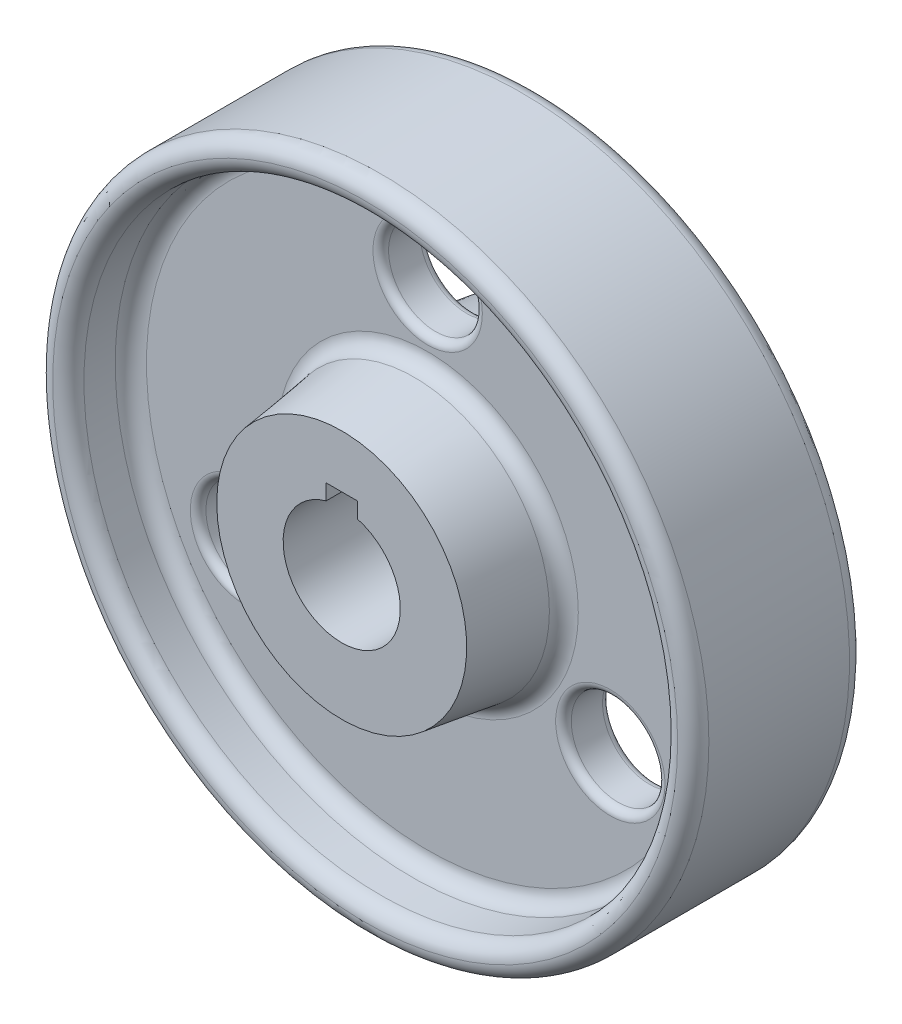
ISO-10303-21;
HEADER;
FILE_DESCRIPTION(('STEP AP214'),'2;1');
FILE_NAME('part.step','',(''),(''),'','','');
FILE_SCHEMA(('AUTOMOTIVE_DESIGN { 1 0 10303 214 1 1 1 1 }'));
ENDSEC;
DATA;
#1=APPLICATION_CONTEXT('core data for automotive mechanical design processes');
#2=APPLICATION_PROTOCOL_DEFINITION('international standard','automotive_design',2000,#1);
#3=PRODUCT_CONTEXT('',#1,'mechanical');
#4=PRODUCT('Part','Part','',(#3));
#5=PRODUCT_RELATED_PRODUCT_CATEGORY('part','',(#4));
#6=PRODUCT_DEFINITION_FORMATION('','',#4);
#7=PRODUCT_DEFINITION_CONTEXT('part definition',#1,'design');
#8=PRODUCT_DEFINITION('design','',#6,#7);
#9=PRODUCT_DEFINITION_SHAPE('','',#8);
#10=(LENGTH_UNIT() NAMED_UNIT(*) SI_UNIT(.MILLI.,.METRE.));
#11=(NAMED_UNIT(*) PLANE_ANGLE_UNIT() SI_UNIT($,.RADIAN.));
#12=(NAMED_UNIT(*) SI_UNIT($,.STERADIAN.) SOLID_ANGLE_UNIT());
#13=UNCERTAINTY_MEASURE_WITH_UNIT(LENGTH_MEASURE(1.E-05),#10,'distance_accuracy_value','');
#14=(GEOMETRIC_REPRESENTATION_CONTEXT(3) GLOBAL_UNCERTAINTY_ASSIGNED_CONTEXT((#13)) GLOBAL_UNIT_ASSIGNED_CONTEXT((#10,
#11,#12)) REPRESENTATION_CONTEXT('',''));
#15=CARTESIAN_POINT('',(0.,0.,0.));
#16=DIRECTION('',(0.,0.,1.));
#17=DIRECTION('',(1.,0.,0.));
#18=AXIS2_PLACEMENT_3D('',#15,#16,#17);
#19=CARTESIAN_POINT('',(0.,11.90625,22.225));
#20=DIRECTION('',(0.,0.,1.));
#21=DIRECTION('',(1.,0.,0.));
#22=AXIS2_PLACEMENT_3D('',#19,#20,#21);
#23=PLANE('',#22);
#24=DIRECTION('',(0.,-1.,0.));
#25=VECTOR('',#24,1.);
#26=CARTESIAN_POINT('',(-3.175,14.6501106339983,22.225));
#27=LINE('',#26,#25);
#28=CARTESIAN_POINT('',(-3.175,14.6501106339983,22.225));
#29=VERTEX_POINT('',#28);
#30=CARTESIAN_POINT('',(-3.175,11.4751106339983,22.225));
#31=VERTEX_POINT('',#30);
#32=EDGE_CURVE('E93',#29,#31,#27,.T.);
#33=ORIENTED_EDGE('',*,*,#32,.F.);
#34=DIRECTION('',(-1.,0.,0.));
#35=VECTOR('',#34,1.);
#36=CARTESIAN_POINT('',(-3.175,14.6501106339983,22.225));
#37=LINE('',#36,#35);
#38=CARTESIAN_POINT('',(3.175,14.6501106339983,22.225));
#39=VERTEX_POINT('',#38);
#40=EDGE_CURVE('E106',#39,#29,#37,.T.);
#41=ORIENTED_EDGE('',*,*,#40,.F.);
#42=DIRECTION('',(0.,1.,0.));
#43=VECTOR('',#42,1.);
#44=CARTESIAN_POINT('',(3.175,14.6501106339983,22.225));
#45=LINE('',#44,#43);
#46=CARTESIAN_POINT('',(3.175,11.4751106339983,22.225));
#47=VERTEX_POINT('',#46);
#48=EDGE_CURVE('E526',#47,#39,#45,.T.);
#49=ORIENTED_EDGE('',*,*,#48,.F.);
#50=CARTESIAN_POINT('',(0.,0.,22.225));
#51=DIRECTION('',(0.,0.,-1.));
#52=DIRECTION('',(-1.,0.,0.));
#53=AXIS2_PLACEMENT_3D('',#50,#51,#52);
#54=CIRCLE('',#53,11.90625);
#55=EDGE_CURVE('E110',#47,#31,#54,.T.);
#56=ORIENTED_EDGE('',*,*,#55,.T.);
#57=EDGE_LOOP('',(#33,#41,#49,#56));
#58=FACE_BOUND('',#57,.T.);
#59=CARTESIAN_POINT('',(0.,0.,22.225));
#60=DIRECTION('',(0.,0.,-1.));
#61=DIRECTION('',(-1.,0.,0.));
#62=AXIS2_PLACEMENT_3D('',#59,#60,#61);
#63=CIRCLE('',#62,25.4);
#64=CARTESIAN_POINT('',(-25.4,0.,22.225));
#65=VERTEX_POINT('',#64);
#66=EDGE_CURVE('E113',#65,#65,#63,.T.);
#67=ORIENTED_EDGE('',*,*,#66,.F.);
#68=EDGE_LOOP('',(#67));
#69=FACE_BOUND('',#68,.T.);
#70=ADVANCED_FACE('F46',(#58,#69),#23,.T.);
#71=CARTESIAN_POINT('',(0.,0.,4.7625));
#72=DIRECTION('',(0.,0.,-1.));
#73=DIRECTION('',(-1.,0.,0.));
#74=AXIS2_PLACEMENT_3D('',#71,#72,#73);
#75=CONICAL_SURFACE('',#74,27.8541943259905,0.139626340159547);
#76=CARTESIAN_POINT('',(0.,0.,7.49562540445179));
#77=DIRECTION('',(0.,0.,-1.));
#78=DIRECTION('',(-1.,0.,0.));
#79=AXIS2_PLACEMENT_3D('',#76,#77,#78);
#80=CIRCLE('',#79,27.4700786003025);
#81=CARTESIAN_POINT('',(-27.4700786003025,0.,7.49562540445179));
#82=VERTEX_POINT('',#81);
#83=EDGE_CURVE('E161',#82,#82,#80,.F.);
#84=ORIENTED_EDGE('',*,*,#83,.T.);
#85=EDGE_LOOP('',(#84));
#86=FACE_BOUND('',#85,.T.);
#87=ORIENTED_EDGE('',*,*,#66,.T.);
#88=EDGE_LOOP('',(#87));
#89=FACE_BOUND('',#88,.T.);
#90=ADVANCED_FACE('F207',(#86,#89),#75,.T.);
#91=CARTESIAN_POINT('',(0.,27.8541943259905,4.7625));
#92=DIRECTION('',(0.,0.,1.));
#93=DIRECTION('',(1.,0.,0.));
#94=AXIS2_PLACEMENT_3D('',#91,#92,#93);
#95=PLANE('',#94);
#96=CARTESIAN_POINT('',(0.,0.,4.7625));
#97=DIRECTION('',(0.,0.,1.));
#98=DIRECTION('',(1.,0.,0.));
#99=AXIS2_PLACEMENT_3D('',#96,#97,#98);
#100=CIRCLE('',#99,30.614179718557);
#101=CARTESIAN_POINT('',(30.614179718557,0.,4.7625));
#102=VERTEX_POINT('',#101);
#103=EDGE_CURVE('E158',#102,#102,#100,.F.);
#104=ORIENTED_EDGE('',*,*,#103,.T.);
#105=EDGE_LOOP('',(#104));
#106=FACE_BOUND('',#105,.T.);
#107=CARTESIAN_POINT('',(0.,0.,4.7625));
#108=DIRECTION('',(0.,0.,1.));
#109=DIRECTION('',(1.,0.,0.));
#110=AXIS2_PLACEMENT_3D('',#107,#108,#109);
#111=CIRCLE('',#110,57.15);
#112=CARTESIAN_POINT('',(57.15,0.,4.7625));
#113=VERTEX_POINT('',#112);
#114=EDGE_CURVE('E155',#113,#113,#111,.T.);
#115=ORIENTED_EDGE('',*,*,#114,.T.);
#116=EDGE_LOOP('',(#115));
#117=FACE_BOUND('',#116,.T.);
#118=CARTESIAN_POINT('',(37.1200138697107,-21.4312499999997,4.7625));
#119=DIRECTION('',(0.,0.,1.));
#120=DIRECTION('',(1.,0.,0.));
#121=AXIS2_PLACEMENT_3D('',#118,#119,#120);
#122=CIRCLE('',#121,11.1125);
#123=CARTESIAN_POINT('',(48.2325138697107,-21.4312499999997,4.7625));
#124=VERTEX_POINT('',#123);
#125=EDGE_CURVE('E131',#124,#124,#122,.F.);
#126=ORIENTED_EDGE('',*,*,#125,.T.);
#127=EDGE_LOOP('',(#126));
#128=FACE_BOUND('',#127,.T.);
#129=CARTESIAN_POINT('',(0.,42.8625,4.7625));
#130=DIRECTION('',(0.,0.,1.));
#131=DIRECTION('',(1.,0.,0.));
#132=AXIS2_PLACEMENT_3D('',#129,#130,#131);
#133=CIRCLE('',#132,11.1125);
#134=CARTESIAN_POINT('',(11.1125,42.8625,4.7625));
#135=VERTEX_POINT('',#134);
#136=EDGE_CURVE('E128',#135,#135,#133,.F.);
#137=ORIENTED_EDGE('',*,*,#136,.T.);
#138=EDGE_LOOP('',(#137));
#139=FACE_BOUND('',#138,.T.);
#140=CARTESIAN_POINT('',(-37.1200138697104,-21.4312500000002,4.7625));
#141=DIRECTION('',(0.,0.,1.));
#142=DIRECTION('',(1.,0.,0.));
#143=AXIS2_PLACEMENT_3D('',#140,#141,#142);
#144=CIRCLE('',#143,11.1125);
#145=CARTESIAN_POINT('',(-26.0075138697104,-21.4312500000002,4.7625));
#146=VERTEX_POINT('',#145);
#147=EDGE_CURVE('E125',#146,#146,#144,.F.);
#148=ORIENTED_EDGE('',*,*,#147,.T.);
#149=EDGE_LOOP('',(#148));
#150=FACE_BOUND('',#149,.T.);
#151=ADVANCED_FACE('F213',(#106,#117,#128,#139,#150),#95,.T.);
#152=CARTESIAN_POINT('',(0.,0.,60.));
#153=DIRECTION('',(0.,0.,-1.));
#154=DIRECTION('',(-1.,0.,0.));
#155=AXIS2_PLACEMENT_3D('',#152,#153,#154);
#156=CYLINDRICAL_SURFACE('',#155,60.325);
#157=CARTESIAN_POINT('',(0.,0.,7.9375));
#158=DIRECTION('',(0.,0.,1.));
#159=DIRECTION('',(1.,0.,0.));
#160=AXIS2_PLACEMENT_3D('',#157,#158,#159);
#161=CIRCLE('',#160,60.325);
#162=CARTESIAN_POINT('',(60.325,0.,7.9375));
#163=VERTEX_POINT('',#162);
#164=EDGE_CURVE('E167',#163,#163,#161,.F.);
#165=ORIENTED_EDGE('',*,*,#164,.T.);
#166=EDGE_LOOP('',(#165));
#167=FACE_BOUND('',#166,.T.);
#168=CARTESIAN_POINT('',(0.,0.,14.2875));
#169=DIRECTION('',(0.,0.,1.));
#170=DIRECTION('',(1.,0.,0.));
#171=AXIS2_PLACEMENT_3D('',#168,#169,#170);
#172=CIRCLE('',#171,60.325);
#173=CARTESIAN_POINT('',(60.325,0.,14.2875));
#174=VERTEX_POINT('',#173);
#175=EDGE_CURVE('E164',#174,#174,#172,.T.);
#176=ORIENTED_EDGE('',*,*,#175,.T.);
#177=EDGE_LOOP('',(#176));
#178=FACE_BOUND('',#177,.T.);
#179=ADVANCED_FACE('F313',(#167,#178),#156,.F.);
#180=CARTESIAN_POINT('',(0.,0.,60.));
#181=DIRECTION('',(0.,0.,-1.));
#182=DIRECTION('',(-1.,0.,0.));
#183=AXIS2_PLACEMENT_3D('',#180,#181,#182);
#184=CYLINDRICAL_SURFACE('',#183,66.675);
#185=CARTESIAN_POINT('',(0.,0.,-14.2875));
#186=DIRECTION('',(0.,0.,-1.));
#187=DIRECTION('',(-1.,0.,0.));
#188=AXIS2_PLACEMENT_3D('',#185,#186,#187);
#189=CIRCLE('',#188,66.675);
#190=CARTESIAN_POINT('',(-66.675,0.,-14.2875));
#191=VERTEX_POINT('',#190);
#192=EDGE_CURVE('E13',#191,#191,#189,.F.);
#193=ORIENTED_EDGE('',*,*,#192,.T.);
#194=EDGE_LOOP('',(#193));
#195=FACE_BOUND('',#194,.T.);
#196=CARTESIAN_POINT('',(0.,0.,14.2875));
#197=DIRECTION('',(0.,0.,1.));
#198=DIRECTION('',(1.,0.,0.));
#199=AXIS2_PLACEMENT_3D('',#196,#197,#198);
#200=CIRCLE('',#199,66.675);
#201=CARTESIAN_POINT('',(66.675,0.,14.2875));
#202=VERTEX_POINT('',#201);
#203=EDGE_CURVE('E54',#202,#202,#200,.F.);
#204=ORIENTED_EDGE('',*,*,#203,.T.);
#205=EDGE_LOOP('',(#204));
#206=FACE_BOUND('',#205,.T.);
#207=ADVANCED_FACE('F193',(#195,#206),#184,.T.);
#208=CARTESIAN_POINT('',(0.,0.,60.));
#209=DIRECTION('',(0.,0.,-1.));
#210=DIRECTION('',(-1.,0.,0.));
#211=AXIS2_PLACEMENT_3D('',#208,#209,#210);
#212=CYLINDRICAL_SURFACE('',#211,60.325);
#213=CARTESIAN_POINT('',(0.,0.,-14.2875));
#214=DIRECTION('',(0.,0.,-1.));
#215=DIRECTION('',(-1.,0.,0.));
#216=AXIS2_PLACEMENT_3D('',#213,#214,#215);
#217=CIRCLE('',#216,60.325);
#218=CARTESIAN_POINT('',(-60.325,0.,-14.2875));
#219=VERTEX_POINT('',#218);
#220=EDGE_CURVE('E185',#219,#219,#217,.T.);
#221=ORIENTED_EDGE('',*,*,#220,.T.);
#222=EDGE_LOOP('',(#221));
#223=FACE_BOUND('',#222,.T.);
#224=CARTESIAN_POINT('',(0.,0.,-7.9375));
#225=DIRECTION('',(0.,0.,-1.));
#226=DIRECTION('',(-1.,0.,0.));
#227=AXIS2_PLACEMENT_3D('',#224,#225,#226);
#228=CIRCLE('',#227,60.325);
#229=CARTESIAN_POINT('',(-60.325,0.,-7.9375));
#230=VERTEX_POINT('',#229);
#231=EDGE_CURVE('E182',#230,#230,#228,.F.);
#232=ORIENTED_EDGE('',*,*,#231,.T.);
#233=EDGE_LOOP('',(#232));
#234=FACE_BOUND('',#233,.T.);
#235=ADVANCED_FACE('F276',(#223,#234),#212,.F.);
#236=CARTESIAN_POINT('',(0.,60.325,-4.7625));
#237=DIRECTION('',(0.,0.,-1.));
#238=DIRECTION('',(-1.,0.,0.));
#239=AXIS2_PLACEMENT_3D('',#236,#237,#238);
#240=PLANE('',#239);
#241=CARTESIAN_POINT('',(0.,0.,-4.7625));
#242=DIRECTION('',(0.,0.,-1.));
#243=DIRECTION('',(-1.,0.,0.));
#244=AXIS2_PLACEMENT_3D('',#241,#242,#243);
#245=CIRCLE('',#244,30.614179718557);
#246=CARTESIAN_POINT('',(-30.614179718557,0.,-4.7625));
#247=VERTEX_POINT('',#246);
#248=EDGE_CURVE('E179',#247,#247,#245,.F.);
#249=ORIENTED_EDGE('',*,*,#248,.T.);
#250=EDGE_LOOP('',(#249));
#251=FACE_BOUND('',#250,.T.);
#252=CARTESIAN_POINT('',(0.,0.,-4.7625));
#253=DIRECTION('',(0.,0.,-1.));
#254=DIRECTION('',(-1.,0.,0.));
#255=AXIS2_PLACEMENT_3D('',#252,#253,#254);
#256=CIRCLE('',#255,57.15);
#257=CARTESIAN_POINT('',(-57.15,0.,-4.7625));
#258=VERTEX_POINT('',#257);
#259=EDGE_CURVE('E176',#258,#258,#256,.T.);
#260=ORIENTED_EDGE('',*,*,#259,.T.);
#261=EDGE_LOOP('',(#260));
#262=FACE_BOUND('',#261,.T.);
#263=CARTESIAN_POINT('',(0.,42.8625,-4.7625));
#264=DIRECTION('',(0.,0.,-1.));
#265=DIRECTION('',(-1.,0.,0.));
#266=AXIS2_PLACEMENT_3D('',#263,#264,#265);
#267=CIRCLE('',#266,11.1125);
#268=CARTESIAN_POINT('',(-11.1125,42.8625,-4.7625));
#269=VERTEX_POINT('',#268);
#270=EDGE_CURVE('E152',#269,#269,#267,.F.);
#271=ORIENTED_EDGE('',*,*,#270,.T.);
#272=EDGE_LOOP('',(#271));
#273=FACE_BOUND('',#272,.T.);
#274=CARTESIAN_POINT('',(37.1200138697107,-21.4312499999997,-4.7625));
#275=DIRECTION('',(0.,0.,-1.));
#276=DIRECTION('',(-1.,0.,0.));
#277=AXIS2_PLACEMENT_3D('',#274,#275,#276);
#278=CIRCLE('',#277,11.1125);
#279=CARTESIAN_POINT('',(26.0075138697107,-21.4312499999997,-4.7625));
#280=VERTEX_POINT('',#279);
#281=EDGE_CURVE('E149',#280,#280,#278,.F.);
#282=ORIENTED_EDGE('',*,*,#281,.T.);
#283=EDGE_LOOP('',(#282));
#284=FACE_BOUND('',#283,.T.);
#285=CARTESIAN_POINT('',(-37.1200138697104,-21.4312500000002,-4.7625));
#286=DIRECTION('',(0.,0.,-1.));
#287=DIRECTION('',(-1.,0.,0.));
#288=AXIS2_PLACEMENT_3D('',#285,#286,#287);
#289=CIRCLE('',#288,11.1125);
#290=CARTESIAN_POINT('',(-48.2325138697104,-21.4312500000002,-4.7625));
#291=VERTEX_POINT('',#290);
#292=EDGE_CURVE('E146',#291,#291,#289,.F.);
#293=ORIENTED_EDGE('',*,*,#292,.T.);
#294=EDGE_LOOP('',(#293));
#295=FACE_BOUND('',#294,.T.);
#296=ADVANCED_FACE('F272',(#251,#262,#273,#284,#295),#240,.T.);
#297=CARTESIAN_POINT('',(0.,0.,-22.225));
#298=DIRECTION('',(0.,0.,1.));
#299=DIRECTION('',(1.,0.,0.));
#300=AXIS2_PLACEMENT_3D('',#297,#298,#299);
#301=CONICAL_SURFACE('',#300,25.4,0.139626340159547);
#302=CARTESIAN_POINT('',(0.,0.,-7.49562540445179));
#303=DIRECTION('',(0.,0.,1.));
#304=DIRECTION('',(1.,0.,0.));
#305=AXIS2_PLACEMENT_3D('',#302,#303,#304);
#306=CIRCLE('',#305,27.4700786003025);
#307=CARTESIAN_POINT('',(27.4700786003025,0.,-7.49562540445179));
#308=VERTEX_POINT('',#307);
#309=EDGE_CURVE('E173',#308,#308,#306,.F.);
#310=ORIENTED_EDGE('',*,*,#309,.T.);
#311=EDGE_LOOP('',(#310));
#312=FACE_BOUND('',#311,.T.);
#313=CARTESIAN_POINT('',(0.,0.,-22.225));
#314=DIRECTION('',(0.,0.,-1.));
#315=DIRECTION('',(-1.,0.,0.));
#316=AXIS2_PLACEMENT_3D('',#313,#314,#315);
#317=CIRCLE('',#316,25.4);
#318=CARTESIAN_POINT('',(-25.4,0.,-22.225));
#319=VERTEX_POINT('',#318);
#320=EDGE_CURVE('E109',#319,#319,#317,.T.);
#321=ORIENTED_EDGE('',*,*,#320,.F.);
#322=EDGE_LOOP('',(#321));
#323=FACE_BOUND('',#322,.T.);
#324=ADVANCED_FACE('F275',(#312,#323),#301,.T.);
#325=CARTESIAN_POINT('',(0.,11.90625,-22.225));
#326=DIRECTION('',(0.,0.,-1.));
#327=DIRECTION('',(-1.,0.,0.));
#328=AXIS2_PLACEMENT_3D('',#325,#326,#327);
#329=PLANE('',#328);
#330=DIRECTION('',(0.,-1.,0.));
#331=VECTOR('',#330,1.);
#332=CARTESIAN_POINT('',(-3.175,14.6501106339983,-22.225));
#333=LINE('',#332,#331);
#334=CARTESIAN_POINT('',(-3.175,14.6501106339983,-22.225));
#335=VERTEX_POINT('',#334);
#336=CARTESIAN_POINT('',(-3.175,11.4751106339983,-22.225));
#337=VERTEX_POINT('',#336);
#338=EDGE_CURVE('E90',#335,#337,#333,.T.);
#339=ORIENTED_EDGE('',*,*,#338,.T.);
#340=CARTESIAN_POINT('',(0.,0.,-22.225));
#341=DIRECTION('',(0.,0.,-1.));
#342=DIRECTION('',(-1.,0.,0.));
#343=AXIS2_PLACEMENT_3D('',#340,#341,#342);
#344=CIRCLE('',#343,11.90625);
#345=CARTESIAN_POINT('',(3.175,11.4751106339983,-22.225));
#346=VERTEX_POINT('',#345);
#347=EDGE_CURVE('E105',#346,#337,#344,.T.);
#348=ORIENTED_EDGE('',*,*,#347,.F.);
#349=DIRECTION('',(0.,1.,0.));
#350=VECTOR('',#349,1.);
#351=CARTESIAN_POINT('',(3.175,14.6501106339983,-22.225));
#352=LINE('',#351,#350);
#353=CARTESIAN_POINT('',(3.175,14.6501106339983,-22.225));
#354=VERTEX_POINT('',#353);
#355=EDGE_CURVE('E61',#346,#354,#352,.T.);
#356=ORIENTED_EDGE('',*,*,#355,.T.);
#357=DIRECTION('',(-1.,0.,0.));
#358=VECTOR('',#357,1.);
#359=CARTESIAN_POINT('',(-3.175,14.6501106339983,-22.225));
#360=LINE('',#359,#358);
#361=EDGE_CURVE('E99',#354,#335,#360,.T.);
#362=ORIENTED_EDGE('',*,*,#361,.T.);
#363=EDGE_LOOP('',(#339,#348,#356,#362));
#364=FACE_BOUND('',#363,.T.);
#365=ORIENTED_EDGE('',*,*,#320,.T.);
#366=EDGE_LOOP('',(#365));
#367=FACE_BOUND('',#366,.T.);
#368=ADVANCED_FACE('F103',(#364,#367),#329,.T.);
#369=CARTESIAN_POINT('',(0.,0.,60.));
#370=DIRECTION('',(0.,0.,-1.));
#371=DIRECTION('',(-1.,0.,0.));
#372=AXIS2_PLACEMENT_3D('',#369,#370,#371);
#373=CYLINDRICAL_SURFACE('',#372,11.90625);
#374=DIRECTION('',(0.,0.,1.));
#375=VECTOR('',#374,1.);
#376=CARTESIAN_POINT('',(-3.175,11.4751106339983,-22.225));
#377=LINE('',#376,#375);
#378=EDGE_CURVE('E87',#337,#31,#377,.T.);
#379=ORIENTED_EDGE('',*,*,#378,.T.);
#380=ORIENTED_EDGE('',*,*,#55,.F.);
#381=DIRECTION('',(0.,0.,1.));
#382=VECTOR('',#381,1.);
#383=CARTESIAN_POINT('',(3.175,11.4751106339983,-22.225));
#384=LINE('',#383,#382);
#385=EDGE_CURVE('E98',#346,#47,#384,.T.);
#386=ORIENTED_EDGE('',*,*,#385,.F.);
#387=ORIENTED_EDGE('',*,*,#347,.T.);
#388=EDGE_LOOP('',(#379,#380,#386,#387));
#389=FACE_BOUND('',#388,.T.);
#390=ADVANCED_FACE('F108',(#389),#373,.F.);
#391=CARTESIAN_POINT('',(0.,42.8625,4.7625));
#392=DIRECTION('',(0.,0.,1.));
#393=DIRECTION('',(1.,0.,0.));
#394=AXIS2_PLACEMENT_3D('',#391,#392,#393);
#395=CYLINDRICAL_SURFACE('',#394,9.52499999999999);
#396=CARTESIAN_POINT('',(0.,42.8625,3.175));
#397=DIRECTION('',(0.,0.,1.));
#398=DIRECTION('',(1.,0.,0.));
#399=AXIS2_PLACEMENT_3D('',#396,#397,#398);
#400=CIRCLE('',#399,9.52499999999999);
#401=CARTESIAN_POINT('',(9.52499999999999,42.8625,3.175));
#402=VERTEX_POINT('',#401);
#403=EDGE_CURVE('E137',#402,#402,#400,.T.);
#404=ORIENTED_EDGE('',*,*,#403,.T.);
#405=EDGE_LOOP('',(#404));
#406=FACE_BOUND('',#405,.T.);
#407=CARTESIAN_POINT('',(0.,42.8625,-3.175));
#408=DIRECTION('',(0.,0.,-1.));
#409=DIRECTION('',(-1.,0.,0.));
#410=AXIS2_PLACEMENT_3D('',#407,#408,#409);
#411=CIRCLE('',#410,9.52499999999999);
#412=CARTESIAN_POINT('',(-9.52499999999999,42.8625,-3.175));
#413=VERTEX_POINT('',#412);
#414=EDGE_CURVE('E134',#413,#413,#411,.T.);
#415=ORIENTED_EDGE('',*,*,#414,.T.);
#416=EDGE_LOOP('',(#415));
#417=FACE_BOUND('',#416,.T.);
#418=ADVANCED_FACE('F289',(#406,#417),#395,.F.);
#419=CARTESIAN_POINT('',(-37.1200138697104,-21.4312500000002,4.7625));
#420=DIRECTION('',(0.,0.,1.));
#421=DIRECTION('',(1.,0.,0.));
#422=AXIS2_PLACEMENT_3D('',#419,#420,#421);
#423=CYLINDRICAL_SURFACE('',#422,9.52499999999999);
#424=CARTESIAN_POINT('',(-37.1200138697104,-21.4312500000002,3.175));
#425=DIRECTION('',(0.,0.,1.));
#426=DIRECTION('',(1.,0.,0.));
#427=AXIS2_PLACEMENT_3D('',#424,#425,#426);
#428=CIRCLE('',#427,9.52499999999999);
#429=CARTESIAN_POINT('',(-27.5950138697104,-21.4312500000002,3.175));
#430=VERTEX_POINT('',#429);
#431=EDGE_CURVE('E143',#430,#430,#428,.T.);
#432=ORIENTED_EDGE('',*,*,#431,.T.);
#433=EDGE_LOOP('',(#432));
#434=FACE_BOUND('',#433,.T.);
#435=CARTESIAN_POINT('',(-37.1200138697104,-21.4312500000002,-3.175));
#436=DIRECTION('',(0.,0.,-1.));
#437=DIRECTION('',(-1.,0.,0.));
#438=AXIS2_PLACEMENT_3D('',#435,#436,#437);
#439=CIRCLE('',#438,9.52499999999999);
#440=CARTESIAN_POINT('',(-46.6450138697104,-21.4312500000002,-3.175));
#441=VERTEX_POINT('',#440);
#442=EDGE_CURVE('E140',#441,#441,#439,.T.);
#443=ORIENTED_EDGE('',*,*,#442,.T.);
#444=EDGE_LOOP('',(#443));
#445=FACE_BOUND('',#444,.T.);
#446=ADVANCED_FACE('F287',(#434,#445),#423,.F.);
#447=CARTESIAN_POINT('',(37.1200138697107,-21.4312499999997,4.7625));
#448=DIRECTION('',(0.,0.,1.));
#449=DIRECTION('',(1.,0.,0.));
#450=AXIS2_PLACEMENT_3D('',#447,#448,#449);
#451=CYLINDRICAL_SURFACE('',#450,9.52499999999999);
#452=CARTESIAN_POINT('',(37.1200138697107,-21.4312499999997,3.175));
#453=DIRECTION('',(0.,0.,1.));
#454=DIRECTION('',(1.,0.,0.));
#455=AXIS2_PLACEMENT_3D('',#452,#453,#454);
#456=CIRCLE('',#455,9.52499999999999);
#457=CARTESIAN_POINT('',(46.6450138697107,-21.4312499999997,3.175));
#458=VERTEX_POINT('',#457);
#459=EDGE_CURVE('E122',#458,#458,#456,.T.);
#460=ORIENTED_EDGE('',*,*,#459,.T.);
#461=EDGE_LOOP('',(#460));
#462=FACE_BOUND('',#461,.T.);
#463=CARTESIAN_POINT('',(37.1200138697107,-21.4312499999997,-3.175));
#464=DIRECTION('',(0.,0.,-1.));
#465=DIRECTION('',(-1.,0.,0.));
#466=AXIS2_PLACEMENT_3D('',#463,#464,#465);
#467=CIRCLE('',#466,9.52499999999999);
#468=CARTESIAN_POINT('',(27.5950138697107,-21.4312499999997,-3.175));
#469=VERTEX_POINT('',#468);
#470=EDGE_CURVE('E119',#469,#469,#467,.T.);
#471=ORIENTED_EDGE('',*,*,#470,.T.);
#472=EDGE_LOOP('',(#471));
#473=FACE_BOUND('',#472,.T.);
#474=ADVANCED_FACE('F223',(#462,#473),#451,.F.);
#475=CARTESIAN_POINT('',(37.1200138697107,-21.4312499999997,3.175));
#476=DIRECTION('',(0.,0.,1.));
#477=DIRECTION('',(1.,0.,0.));
#478=AXIS2_PLACEMENT_3D('',#475,#476,#477);
#479=TOROIDAL_SURFACE('',#478,11.1125,1.5875);
#480=ORIENTED_EDGE('',*,*,#125,.F.);
#481=EDGE_LOOP('',(#480));
#482=FACE_BOUND('',#481,.T.);
#483=ORIENTED_EDGE('',*,*,#459,.F.);
#484=EDGE_LOOP('',(#483));
#485=FACE_BOUND('',#484,.T.);
#486=ADVANCED_FACE('F219',(#482,#485),#479,.T.);
#487=CARTESIAN_POINT('',(0.,42.8625,3.175));
#488=DIRECTION('',(0.,0.,1.));
#489=DIRECTION('',(1.,0.,0.));
#490=AXIS2_PLACEMENT_3D('',#487,#488,#489);
#491=TOROIDAL_SURFACE('',#490,11.1125,1.5875);
#492=ORIENTED_EDGE('',*,*,#136,.F.);
#493=EDGE_LOOP('',(#492));
#494=FACE_BOUND('',#493,.T.);
#495=ORIENTED_EDGE('',*,*,#403,.F.);
#496=EDGE_LOOP('',(#495));
#497=FACE_BOUND('',#496,.T.);
#498=ADVANCED_FACE('F222',(#494,#497),#491,.T.);
#499=CARTESIAN_POINT('',(-37.1200138697104,-21.4312500000002,3.175));
#500=DIRECTION('',(0.,0.,1.));
#501=DIRECTION('',(1.,0.,0.));
#502=AXIS2_PLACEMENT_3D('',#499,#500,#501);
#503=TOROIDAL_SURFACE('',#502,11.1125,1.5875);
#504=ORIENTED_EDGE('',*,*,#147,.F.);
#505=EDGE_LOOP('',(#504));
#506=FACE_BOUND('',#505,.T.);
#507=ORIENTED_EDGE('',*,*,#431,.F.);
#508=EDGE_LOOP('',(#507));
#509=FACE_BOUND('',#508,.T.);
#510=ADVANCED_FACE('F227',(#506,#509),#503,.T.);
#511=CARTESIAN_POINT('',(0.,42.8625,-3.175));
#512=DIRECTION('',(0.,0.,-1.));
#513=DIRECTION('',(-1.,0.,0.));
#514=AXIS2_PLACEMENT_3D('',#511,#512,#513);
#515=TOROIDAL_SURFACE('',#514,11.1125,1.5875);
#516=ORIENTED_EDGE('',*,*,#270,.F.);
#517=EDGE_LOOP('',(#516));
#518=FACE_BOUND('',#517,.T.);
#519=ORIENTED_EDGE('',*,*,#414,.F.);
#520=EDGE_LOOP('',(#519));
#521=FACE_BOUND('',#520,.T.);
#522=ADVANCED_FACE('F231',(#518,#521),#515,.T.);
#523=CARTESIAN_POINT('',(37.1200138697107,-21.4312499999997,-3.175));
#524=DIRECTION('',(0.,0.,-1.));
#525=DIRECTION('',(-1.,0.,0.));
#526=AXIS2_PLACEMENT_3D('',#523,#524,#525);
#527=TOROIDAL_SURFACE('',#526,11.1125,1.5875);
#528=ORIENTED_EDGE('',*,*,#281,.F.);
#529=EDGE_LOOP('',(#528));
#530=FACE_BOUND('',#529,.T.);
#531=ORIENTED_EDGE('',*,*,#470,.F.);
#532=EDGE_LOOP('',(#531));
#533=FACE_BOUND('',#532,.T.);
#534=ADVANCED_FACE('F235',(#530,#533),#527,.T.);
#535=CARTESIAN_POINT('',(-37.1200138697104,-21.4312500000002,-3.175));
#536=DIRECTION('',(0.,0.,-1.));
#537=DIRECTION('',(-1.,0.,0.));
#538=AXIS2_PLACEMENT_3D('',#535,#536,#537);
#539=TOROIDAL_SURFACE('',#538,11.1125,1.5875);
#540=ORIENTED_EDGE('',*,*,#292,.F.);
#541=EDGE_LOOP('',(#540));
#542=FACE_BOUND('',#541,.T.);
#543=ORIENTED_EDGE('',*,*,#442,.F.);
#544=EDGE_LOOP('',(#543));
#545=FACE_BOUND('',#544,.T.);
#546=ADVANCED_FACE('F239',(#542,#545),#539,.T.);
#547=CARTESIAN_POINT('',(0.,0.,7.9375));
#548=DIRECTION('',(0.,0.,1.));
#549=DIRECTION('',(1.,0.,0.));
#550=AXIS2_PLACEMENT_3D('',#547,#548,#549);
#551=TOROIDAL_SURFACE('',#550,30.614179718557,3.175);
#552=ORIENTED_EDGE('',*,*,#83,.F.);
#553=EDGE_LOOP('',(#552));
#554=FACE_BOUND('',#553,.T.);
#555=ORIENTED_EDGE('',*,*,#103,.F.);
#556=EDGE_LOOP('',(#555));
#557=FACE_BOUND('',#556,.T.);
#558=ADVANCED_FACE('F243',(#554,#557),#551,.F.);
#559=CARTESIAN_POINT('',(0.,0.,7.9375));
#560=DIRECTION('',(0.,0.,1.));
#561=DIRECTION('',(1.,0.,0.));
#562=AXIS2_PLACEMENT_3D('',#559,#560,#561);
#563=TOROIDAL_SURFACE('',#562,57.15,3.175);
#564=ORIENTED_EDGE('',*,*,#114,.F.);
#565=EDGE_LOOP('',(#564));
#566=FACE_BOUND('',#565,.T.);
#567=ORIENTED_EDGE('',*,*,#164,.F.);
#568=EDGE_LOOP('',(#567));
#569=FACE_BOUND('',#568,.T.);
#570=ADVANCED_FACE('F247',(#566,#569),#563,.F.);
#571=CARTESIAN_POINT('',(0.,0.,14.2875));
#572=DIRECTION('',(0.,0.,1.));
#573=DIRECTION('',(1.,0.,0.));
#574=AXIS2_PLACEMENT_3D('',#571,#572,#573);
#575=TOROIDAL_SURFACE('',#574,63.5,3.175);
#576=ORIENTED_EDGE('',*,*,#175,.F.);
#577=EDGE_LOOP('',(#576));
#578=FACE_BOUND('',#577,.T.);
#579=CARTESIAN_POINT('',(0.,0.,17.4625));
#580=DIRECTION('',(0.,0.,1.));
#581=DIRECTION('',(1.,0.,0.));
#582=AXIS2_PLACEMENT_3D('',#579,#580,#581);
#583=CIRCLE('',#582,63.5);
#584=CARTESIAN_POINT('',(63.5,0.,17.4625));
#585=VERTEX_POINT('',#584);
#586=EDGE_CURVE('E170',#585,#585,#583,.F.);
#587=ORIENTED_EDGE('',*,*,#586,.F.);
#588=EDGE_LOOP('',(#587));
#589=FACE_BOUND('',#588,.T.);
#590=ADVANCED_FACE('F251',(#578,#589),#575,.T.);
#591=CARTESIAN_POINT('',(0.,0.,-7.9375));
#592=DIRECTION('',(0.,0.,-1.));
#593=DIRECTION('',(-1.,0.,0.));
#594=AXIS2_PLACEMENT_3D('',#591,#592,#593);
#595=TOROIDAL_SURFACE('',#594,30.614179718557,3.175);
#596=ORIENTED_EDGE('',*,*,#248,.F.);
#597=EDGE_LOOP('',(#596));
#598=FACE_BOUND('',#597,.T.);
#599=ORIENTED_EDGE('',*,*,#309,.F.);
#600=EDGE_LOOP('',(#599));
#601=FACE_BOUND('',#600,.T.);
#602=ADVANCED_FACE('F255',(#598,#601),#595,.F.);
#603=CARTESIAN_POINT('',(0.,0.,-14.2875));
#604=DIRECTION('',(0.,0.,-1.));
#605=DIRECTION('',(-1.,0.,0.));
#606=AXIS2_PLACEMENT_3D('',#603,#604,#605);
#607=TOROIDAL_SURFACE('',#606,63.5,3.175);
#608=CARTESIAN_POINT('',(0.,0.,-17.4625));
#609=DIRECTION('',(0.,0.,-1.));
#610=DIRECTION('',(-1.,0.,0.));
#611=AXIS2_PLACEMENT_3D('',#608,#609,#610);
#612=CIRCLE('',#611,63.5);
#613=CARTESIAN_POINT('',(-63.5,0.,-17.4625));
#614=VERTEX_POINT('',#613);
#615=EDGE_CURVE('E188',#614,#614,#612,.F.);
#616=ORIENTED_EDGE('',*,*,#615,.F.);
#617=EDGE_LOOP('',(#616));
#618=FACE_BOUND('',#617,.T.);
#619=ORIENTED_EDGE('',*,*,#220,.F.);
#620=EDGE_LOOP('',(#619));
#621=FACE_BOUND('',#620,.T.);
#622=ADVANCED_FACE('F259',(#618,#621),#607,.T.);
#623=CARTESIAN_POINT('',(0.,0.,-7.9375));
#624=DIRECTION('',(0.,0.,-1.));
#625=DIRECTION('',(-1.,0.,0.));
#626=AXIS2_PLACEMENT_3D('',#623,#624,#625);
#627=TOROIDAL_SURFACE('',#626,57.15,3.175);
#628=ORIENTED_EDGE('',*,*,#231,.F.);
#629=EDGE_LOOP('',(#628));
#630=FACE_BOUND('',#629,.T.);
#631=ORIENTED_EDGE('',*,*,#259,.F.);
#632=EDGE_LOOP('',(#631));
#633=FACE_BOUND('',#632,.T.);
#634=ADVANCED_FACE('F204',(#630,#633),#627,.F.);
#635=CARTESIAN_POINT('',(0.,0.,-14.2875));
#636=DIRECTION('',(0.,0.,-1.));
#637=DIRECTION('',(-1.,0.,0.));
#638=AXIS2_PLACEMENT_3D('',#635,#636,#637);
#639=TOROIDAL_SURFACE('',#638,63.5,3.175);
#640=ORIENTED_EDGE('',*,*,#192,.F.);
#641=EDGE_LOOP('',(#640));
#642=FACE_BOUND('',#641,.T.);
#643=ORIENTED_EDGE('',*,*,#615,.T.);
#644=EDGE_LOOP('',(#643));
#645=FACE_BOUND('',#644,.T.);
#646=ADVANCED_FACE('F196',(#642,#645),#639,.T.);
#647=CARTESIAN_POINT('',(0.,0.,14.2875));
#648=DIRECTION('',(0.,0.,1.));
#649=DIRECTION('',(1.,0.,0.));
#650=AXIS2_PLACEMENT_3D('',#647,#648,#649);
#651=TOROIDAL_SURFACE('',#650,63.5,3.175);
#652=ORIENTED_EDGE('',*,*,#586,.T.);
#653=EDGE_LOOP('',(#652));
#654=FACE_BOUND('',#653,.T.);
#655=ORIENTED_EDGE('',*,*,#203,.F.);
#656=EDGE_LOOP('',(#655));
#657=FACE_BOUND('',#656,.T.);
#658=ADVANCED_FACE('F48',(#654,#657),#651,.T.);
#659=CARTESIAN_POINT('',(-3.175,14.6501106339983,-22.225));
#660=DIRECTION('',(-1.,0.,0.));
#661=DIRECTION('',(0.,-1.,0.));
#662=AXIS2_PLACEMENT_3D('',#659,#660,#661);
#663=PLANE('',#662);
#664=ORIENTED_EDGE('',*,*,#32,.T.);
#665=ORIENTED_EDGE('',*,*,#378,.F.);
#666=ORIENTED_EDGE('',*,*,#338,.F.);
#667=DIRECTION('',(0.,0.,1.));
#668=VECTOR('',#667,1.);
#669=CARTESIAN_POINT('',(-3.175,14.6501106339983,-22.225));
#670=LINE('',#669,#668);
#671=EDGE_CURVE('E70',#335,#29,#670,.T.);
#672=ORIENTED_EDGE('',*,*,#671,.T.);
#673=EDGE_LOOP('',(#664,#665,#666,#672));
#674=FACE_BOUND('',#673,.T.);
#675=ADVANCED_FACE('F89',(#674),#663,.F.);
#676=CARTESIAN_POINT('',(-3.175,14.6501106339983,-22.225));
#677=DIRECTION('',(0.,1.,0.));
#678=DIRECTION('',(0.,0.,1.));
#679=AXIS2_PLACEMENT_3D('',#676,#677,#678);
#680=PLANE('',#679);
#681=ORIENTED_EDGE('',*,*,#40,.T.);
#682=ORIENTED_EDGE('',*,*,#671,.F.);
#683=ORIENTED_EDGE('',*,*,#361,.F.);
#684=DIRECTION('',(0.,0.,1.));
#685=VECTOR('',#684,1.);
#686=CARTESIAN_POINT('',(3.175,14.6501106339983,-22.225));
#687=LINE('',#686,#685);
#688=EDGE_CURVE('E528',#354,#39,#687,.T.);
#689=ORIENTED_EDGE('',*,*,#688,.T.);
#690=EDGE_LOOP('',(#681,#682,#683,#689));
#691=FACE_BOUND('',#690,.T.);
#692=ADVANCED_FACE('F202',(#691),#680,.F.);
#693=CARTESIAN_POINT('',(3.175,14.6501106339983,-22.225));
#694=DIRECTION('',(1.,0.,0.));
#695=DIRECTION('',(0.,1.,0.));
#696=AXIS2_PLACEMENT_3D('',#693,#694,#695);
#697=PLANE('',#696);
#698=ORIENTED_EDGE('',*,*,#48,.T.);
#699=ORIENTED_EDGE('',*,*,#688,.F.);
#700=ORIENTED_EDGE('',*,*,#355,.F.);
#701=ORIENTED_EDGE('',*,*,#385,.T.);
#702=EDGE_LOOP('',(#698,#699,#700,#701));
#703=FACE_BOUND('',#702,.T.);
#704=ADVANCED_FACE('F512',(#703),#697,.F.);
#705=CLOSED_SHELL('',(#70,#90,#151,#179,#207,#235,#296,#324,#368,#390,#418,#446,#474,#486,#498,
#510,#522,#534,#546,#558,#570,#590,#602,#622,#634,#646,#658,#675,#692,#704));
#706=MANIFOLD_SOLID_BREP('B2',#705);
#707=ADVANCED_BREP_SHAPE_REPRESENTATION('',(#18,#706),#14);
#708=SHAPE_DEFINITION_REPRESENTATION(#9,#707);
ENDSEC;
END-ISO-10303-21;
